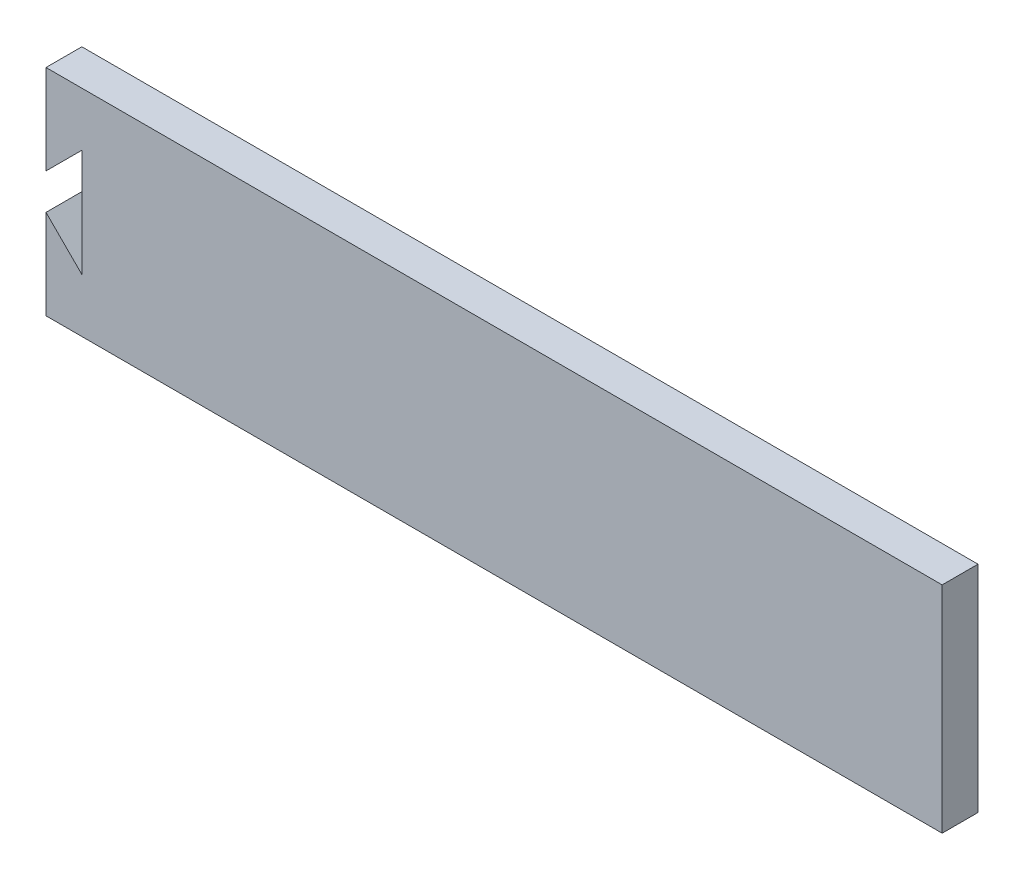
ISO-10303-21;
HEADER;
FILE_DESCRIPTION(('STEP AP214'),'2;1');
FILE_NAME('part.step','',(''),(''),'','','');
FILE_SCHEMA(('AUTOMOTIVE_DESIGN { 1 0 10303 214 1 1 1 1 }'));
ENDSEC;
DATA;
#1=APPLICATION_CONTEXT('core data for automotive mechanical design processes');
#2=APPLICATION_PROTOCOL_DEFINITION('international standard','automotive_design',2000,#1);
#3=PRODUCT_CONTEXT('',#1,'mechanical');
#4=PRODUCT('Part','Part','',(#3));
#5=PRODUCT_RELATED_PRODUCT_CATEGORY('part','',(#4));
#6=PRODUCT_DEFINITION_FORMATION('','',#4);
#7=PRODUCT_DEFINITION_CONTEXT('part definition',#1,'design');
#8=PRODUCT_DEFINITION('design','',#6,#7);
#9=PRODUCT_DEFINITION_SHAPE('','',#8);
#10=(LENGTH_UNIT() NAMED_UNIT(*) SI_UNIT(.MILLI.,.METRE.));
#11=(NAMED_UNIT(*) PLANE_ANGLE_UNIT() SI_UNIT($,.RADIAN.));
#12=(NAMED_UNIT(*) SI_UNIT($,.STERADIAN.) SOLID_ANGLE_UNIT());
#13=UNCERTAINTY_MEASURE_WITH_UNIT(LENGTH_MEASURE(1.E-05),#10,'distance_accuracy_value','');
#14=(GEOMETRIC_REPRESENTATION_CONTEXT(3) GLOBAL_UNCERTAINTY_ASSIGNED_CONTEXT((#13)) GLOBAL_UNIT_ASSIGNED_CONTEXT((#10,
#11,#12)) REPRESENTATION_CONTEXT('',''));
#15=CARTESIAN_POINT('',(0.,0.,0.));
#16=DIRECTION('',(0.,0.,1.));
#17=DIRECTION('',(1.,0.,0.));
#18=AXIS2_PLACEMENT_3D('',#15,#16,#17);
#19=CARTESIAN_POINT('',(-142.927308447937,66.0609037328095,10.));
#20=DIRECTION('',(1.,0.,0.));
#21=DIRECTION('',(0.,0.,-1.));
#22=AXIS2_PLACEMENT_3D('',#19,#20,#21);
#23=PLANE('',#22);
#24=DIRECTION('',(0.,-1.,0.));
#25=VECTOR('',#24,1.);
#26=CARTESIAN_POINT('',(-142.927308447937,66.0609037328095,0.));
#27=LINE('',#26,#25);
#28=CARTESIAN_POINT('',(-142.927308447937,66.0609037328095,0.));
#29=VERTEX_POINT('',#28);
#30=CARTESIAN_POINT('',(-142.927308447937,41.0609037328095,0.));
#31=VERTEX_POINT('',#30);
#32=EDGE_CURVE('E134',#29,#31,#27,.T.);
#33=ORIENTED_EDGE('',*,*,#32,.T.);
#34=DIRECTION('',(0.,0.,-1.));
#35=VECTOR('',#34,1.);
#36=CARTESIAN_POINT('',(-142.927308447937,41.0609037328095,0.));
#37=LINE('',#36,#35);
#38=CARTESIAN_POINT('',(-142.927308447937,41.0609037328095,10.));
#39=VERTEX_POINT('',#38);
#40=EDGE_CURVE('E129',#39,#31,#37,.T.);
#41=ORIENTED_EDGE('',*,*,#40,.F.);
#42=DIRECTION('',(0.,-1.,0.));
#43=VECTOR('',#42,1.);
#44=CARTESIAN_POINT('',(-142.927308447937,66.0609037328095,10.));
#45=LINE('',#44,#43);
#46=CARTESIAN_POINT('',(-142.927308447937,66.0609037328095,10.));
#47=VERTEX_POINT('',#46);
#48=EDGE_CURVE('E161',#47,#39,#45,.T.);
#49=ORIENTED_EDGE('',*,*,#48,.F.);
#50=DIRECTION('',(0.,0.,-1.));
#51=VECTOR('',#50,1.);
#52=CARTESIAN_POINT('',(-142.927308447937,66.0609037328095,10.));
#53=LINE('',#52,#51);
#54=EDGE_CURVE('E146',#47,#29,#53,.T.);
#55=ORIENTED_EDGE('',*,*,#54,.T.);
#56=EDGE_LOOP('',(#33,#41,#49,#55));
#57=FACE_BOUND('',#56,.T.);
#58=ADVANCED_FACE('F38',(#57),#23,.F.);
#59=CARTESIAN_POINT('',(-142.927308447937,31.0609037328095,10.));
#60=VERTEX_POINT('',#59);
#61=CARTESIAN_POINT('',(-142.927308447937,6.06090373280946,10.));
#62=VERTEX_POINT('',#61);
#63=EDGE_CURVE('E86',#60,#62,#45,.T.);
#64=ORIENTED_EDGE('',*,*,#63,.F.);
#65=DIRECTION('',(0.,0.,1.));
#66=VECTOR('',#65,1.);
#67=CARTESIAN_POINT('',(-142.927308447937,31.0609037328095,0.));
#68=LINE('',#67,#66);
#69=CARTESIAN_POINT('',(-142.927308447937,31.0609037328095,0.));
#70=VERTEX_POINT('',#69);
#71=EDGE_CURVE('E118',#70,#60,#68,.T.);
#72=ORIENTED_EDGE('',*,*,#71,.F.);
#73=CARTESIAN_POINT('',(-142.927308447937,6.06090373280946,0.));
#74=VERTEX_POINT('',#73);
#75=EDGE_CURVE('E127',#70,#74,#27,.T.);
#76=ORIENTED_EDGE('',*,*,#75,.T.);
#77=DIRECTION('',(0.,0.,-1.));
#78=VECTOR('',#77,1.);
#79=CARTESIAN_POINT('',(-142.927308447937,6.06090373280946,10.));
#80=LINE('',#79,#78);
#81=EDGE_CURVE('E11',#62,#74,#80,.T.);
#82=ORIENTED_EDGE('',*,*,#81,.F.);
#83=EDGE_LOOP('',(#64,#72,#76,#82));
#84=FACE_BOUND('',#83,.T.);
#85=ADVANCED_FACE('F40',(#84),#23,.F.);
#86=CARTESIAN_POINT('',(-142.927308447937,6.06090373280946,10.));
#87=DIRECTION('',(0.,1.,0.));
#88=DIRECTION('',(0.,0.,1.));
#89=AXIS2_PLACEMENT_3D('',#86,#87,#88);
#90=PLANE('',#89);
#91=DIRECTION('',(1.,0.,0.));
#92=VECTOR('',#91,1.);
#93=CARTESIAN_POINT('',(-142.927308447937,6.06090373280946,0.));
#94=LINE('',#93,#92);
#95=CARTESIAN_POINT('',(107.072691552063,6.06090373280946,0.));
#96=VERTEX_POINT('',#95);
#97=EDGE_CURVE('E133',#74,#96,#94,.T.);
#98=ORIENTED_EDGE('',*,*,#97,.T.);
#99=DIRECTION('',(0.,0.,-1.));
#100=VECTOR('',#99,1.);
#101=CARTESIAN_POINT('',(107.072691552063,6.06090373280946,10.));
#102=LINE('',#101,#100);
#103=CARTESIAN_POINT('',(107.072691552063,6.06090373280946,10.));
#104=VERTEX_POINT('',#103);
#105=EDGE_CURVE('E47',#104,#96,#102,.T.);
#106=ORIENTED_EDGE('',*,*,#105,.F.);
#107=DIRECTION('',(1.,0.,0.));
#108=VECTOR('',#107,1.);
#109=CARTESIAN_POINT('',(-142.927308447937,6.06090373280946,10.));
#110=LINE('',#109,#108);
#111=EDGE_CURVE('E163',#62,#104,#110,.T.);
#112=ORIENTED_EDGE('',*,*,#111,.F.);
#113=ORIENTED_EDGE('',*,*,#81,.T.);
#114=EDGE_LOOP('',(#98,#106,#112,#113));
#115=FACE_BOUND('',#114,.T.);
#116=ADVANCED_FACE('F195',(#115),#90,.F.);
#117=CARTESIAN_POINT('',(107.072691552063,66.0609037328095,10.));
#118=DIRECTION('',(-1.,0.,0.));
#119=DIRECTION('',(0.,-1.,0.));
#120=AXIS2_PLACEMENT_3D('',#117,#118,#119);
#121=PLANE('',#120);
#122=DIRECTION('',(0.,1.,0.));
#123=VECTOR('',#122,1.);
#124=CARTESIAN_POINT('',(107.072691552063,66.0609037328095,0.));
#125=LINE('',#124,#123);
#126=CARTESIAN_POINT('',(107.072691552063,66.0609037328095,0.));
#127=VERTEX_POINT('',#126);
#128=EDGE_CURVE('E73',#96,#127,#125,.T.);
#129=ORIENTED_EDGE('',*,*,#128,.T.);
#130=DIRECTION('',(0.,0.,-1.));
#131=VECTOR('',#130,1.);
#132=CARTESIAN_POINT('',(107.072691552063,66.0609037328095,10.));
#133=LINE('',#132,#131);
#134=CARTESIAN_POINT('',(107.072691552063,66.0609037328095,10.));
#135=VERTEX_POINT('',#134);
#136=EDGE_CURVE('E148',#135,#127,#133,.T.);
#137=ORIENTED_EDGE('',*,*,#136,.F.);
#138=DIRECTION('',(0.,1.,0.));
#139=VECTOR('',#138,1.);
#140=CARTESIAN_POINT('',(107.072691552063,66.0609037328095,10.));
#141=LINE('',#140,#139);
#142=EDGE_CURVE('E152',#104,#135,#141,.T.);
#143=ORIENTED_EDGE('',*,*,#142,.F.);
#144=ORIENTED_EDGE('',*,*,#105,.T.);
#145=EDGE_LOOP('',(#129,#137,#143,#144));
#146=FACE_BOUND('',#145,.T.);
#147=ADVANCED_FACE('F151',(#146),#121,.F.);
#148=CARTESIAN_POINT('',(-142.927308447937,66.0609037328095,10.));
#149=DIRECTION('',(0.,-1.,0.));
#150=DIRECTION('',(0.,0.,-1.));
#151=AXIS2_PLACEMENT_3D('',#148,#149,#150);
#152=PLANE('',#151);
#153=DIRECTION('',(-1.,0.,0.));
#154=VECTOR('',#153,1.);
#155=CARTESIAN_POINT('',(-142.927308447937,66.0609037328095,0.));
#156=LINE('',#155,#154);
#157=EDGE_CURVE('E79',#127,#29,#156,.T.);
#158=ORIENTED_EDGE('',*,*,#157,.T.);
#159=ORIENTED_EDGE('',*,*,#54,.F.);
#160=DIRECTION('',(-1.,0.,0.));
#161=VECTOR('',#160,1.);
#162=CARTESIAN_POINT('',(-142.927308447937,66.0609037328095,10.));
#163=LINE('',#162,#161);
#164=EDGE_CURVE('E55',#135,#47,#163,.T.);
#165=ORIENTED_EDGE('',*,*,#164,.F.);
#166=ORIENTED_EDGE('',*,*,#136,.T.);
#167=EDGE_LOOP('',(#158,#159,#165,#166));
#168=FACE_BOUND('',#167,.T.);
#169=ADVANCED_FACE('F162',(#168),#152,.F.);
#170=CARTESIAN_POINT('',(0.,0.,10.));
#171=DIRECTION('',(0.,0.,1.));
#172=DIRECTION('',(1.,0.,0.));
#173=AXIS2_PLACEMENT_3D('',#170,#171,#172);
#174=PLANE('',#173);
#175=DIRECTION('',(0.,1.,0.));
#176=VECTOR('',#175,1.);
#177=CARTESIAN_POINT('',(-132.927308447937,41.0609037328095,10.));
#178=LINE('',#177,#176);
#179=CARTESIAN_POINT('',(-132.927308447937,21.0609037328096,10.));
#180=VERTEX_POINT('',#179);
#181=CARTESIAN_POINT('',(-132.927308447937,51.0609037328094,10.));
#182=VERTEX_POINT('',#181);
#183=EDGE_CURVE('E135',#180,#182,#178,.T.);
#184=ORIENTED_EDGE('',*,*,#183,.F.);
#185=DIRECTION('',(0.707106781186551,-0.707106781186544,0.));
#186=VECTOR('',#185,1.);
#187=CARTESIAN_POINT('',(-142.927308447937,31.0609037328095,10.));
#188=LINE('',#187,#186);
#189=EDGE_CURVE('E123',#60,#180,#188,.T.);
#190=ORIENTED_EDGE('',*,*,#189,.F.);
#191=ORIENTED_EDGE('',*,*,#63,.T.);
#192=ORIENTED_EDGE('',*,*,#111,.T.);
#193=ORIENTED_EDGE('',*,*,#142,.T.);
#194=ORIENTED_EDGE('',*,*,#164,.T.);
#195=ORIENTED_EDGE('',*,*,#48,.T.);
#196=DIRECTION('',(-0.707106781186551,-0.707106781186544,0.));
#197=VECTOR('',#196,1.);
#198=CARTESIAN_POINT('',(-142.927308447937,41.0609037328095,10.));
#199=LINE('',#198,#197);
#200=EDGE_CURVE('E171',#182,#39,#199,.T.);
#201=ORIENTED_EDGE('',*,*,#200,.F.);
#202=EDGE_LOOP('',(#184,#190,#191,#192,#193,#194,#195,#201));
#203=FACE_BOUND('',#202,.T.);
#204=ADVANCED_FACE('F175',(#203),#174,.T.);
#205=CARTESIAN_POINT('',(0.,0.,0.));
#206=DIRECTION('',(0.,0.,1.));
#207=DIRECTION('',(1.,0.,0.));
#208=AXIS2_PLACEMENT_3D('',#205,#206,#207);
#209=PLANE('',#208);
#210=DIRECTION('',(0.707106781186551,-0.707106781186544,0.));
#211=VECTOR('',#210,1.);
#212=CARTESIAN_POINT('',(-142.927308447937,31.0609037328095,0.));
#213=LINE('',#212,#211);
#214=CARTESIAN_POINT('',(-132.927308447937,21.0609037328096,0.));
#215=VERTEX_POINT('',#214);
#216=EDGE_CURVE('E114',#70,#215,#213,.T.);
#217=ORIENTED_EDGE('',*,*,#216,.T.);
#218=DIRECTION('',(0.,-1.,0.));
#219=VECTOR('',#218,1.);
#220=CARTESIAN_POINT('',(-132.927308447937,41.0609037328095,0.));
#221=LINE('',#220,#219);
#222=CARTESIAN_POINT('',(-132.927308447937,51.0609037328094,0.));
#223=VERTEX_POINT('',#222);
#224=EDGE_CURVE('E138',#223,#215,#221,.T.);
#225=ORIENTED_EDGE('',*,*,#224,.F.);
#226=DIRECTION('',(-0.707106781186551,-0.707106781186544,0.));
#227=VECTOR('',#226,1.);
#228=CARTESIAN_POINT('',(-142.927308447937,41.0609037328095,0.));
#229=LINE('',#228,#227);
#230=EDGE_CURVE('E157',#223,#31,#229,.T.);
#231=ORIENTED_EDGE('',*,*,#230,.T.);
#232=ORIENTED_EDGE('',*,*,#32,.F.);
#233=ORIENTED_EDGE('',*,*,#157,.F.);
#234=ORIENTED_EDGE('',*,*,#128,.F.);
#235=ORIENTED_EDGE('',*,*,#97,.F.);
#236=ORIENTED_EDGE('',*,*,#75,.F.);
#237=EDGE_LOOP('',(#217,#225,#231,#232,#233,#234,#235,#236));
#238=FACE_BOUND('',#237,.T.);
#239=ADVANCED_FACE('F132',(#238),#209,.F.);
#240=CARTESIAN_POINT('',(-132.927308447937,0.,0.));
#241=DIRECTION('',(-1.,0.,0.));
#242=DIRECTION('',(0.,0.,1.));
#243=AXIS2_PLACEMENT_3D('',#240,#241,#242);
#244=PLANE('',#243);
#245=ORIENTED_EDGE('',*,*,#224,.T.);
#246=DIRECTION('',(0.,0.,1.));
#247=VECTOR('',#246,1.);
#248=CARTESIAN_POINT('',(-132.927308447937,21.0609037328096,0.));
#249=LINE('',#248,#247);
#250=EDGE_CURVE('E120',#215,#180,#249,.T.);
#251=ORIENTED_EDGE('',*,*,#250,.T.);
#252=ORIENTED_EDGE('',*,*,#183,.T.);
#253=DIRECTION('',(0.,0.,1.));
#254=VECTOR('',#253,1.);
#255=CARTESIAN_POINT('',(-132.927308447937,51.0609037328094,0.));
#256=LINE('',#255,#254);
#257=EDGE_CURVE('E130',#223,#182,#256,.T.);
#258=ORIENTED_EDGE('',*,*,#257,.F.);
#259=EDGE_LOOP('',(#245,#251,#252,#258));
#260=FACE_BOUND('',#259,.T.);
#261=ADVANCED_FACE('F179',(#260),#244,.T.);
#262=CARTESIAN_POINT('',(-142.927308447937,41.0609037328095,0.));
#263=DIRECTION('',(-0.707106781186544,0.707106781186551,0.));
#264=DIRECTION('',(-0.707106781186551,-0.707106781186544,0.));
#265=AXIS2_PLACEMENT_3D('',#262,#263,#264);
#266=PLANE('',#265);
#267=ORIENTED_EDGE('',*,*,#200,.T.);
#268=ORIENTED_EDGE('',*,*,#40,.T.);
#269=ORIENTED_EDGE('',*,*,#230,.F.);
#270=ORIENTED_EDGE('',*,*,#257,.T.);
#271=EDGE_LOOP('',(#267,#268,#269,#270));
#272=FACE_BOUND('',#271,.T.);
#273=ADVANCED_FACE('F181',(#272),#266,.F.);
#274=CARTESIAN_POINT('',(-142.927308447937,31.0609037328095,0.));
#275=DIRECTION('',(-0.707106781186544,-0.707106781186551,0.));
#276=DIRECTION('',(0.707106781186551,-0.707106781186544,0.));
#277=AXIS2_PLACEMENT_3D('',#274,#275,#276);
#278=PLANE('',#277);
#279=ORIENTED_EDGE('',*,*,#189,.T.);
#280=ORIENTED_EDGE('',*,*,#250,.F.);
#281=ORIENTED_EDGE('',*,*,#216,.F.);
#282=ORIENTED_EDGE('',*,*,#71,.T.);
#283=EDGE_LOOP('',(#279,#280,#281,#282));
#284=FACE_BOUND('',#283,.T.);
#285=ADVANCED_FACE('F117',(#284),#278,.F.);
#286=CLOSED_SHELL('',(#58,#85,#116,#147,#169,#204,#239,#261,#273,#285));
#287=MANIFOLD_SOLID_BREP('B2',#286);
#288=ADVANCED_BREP_SHAPE_REPRESENTATION('',(#18,#287),#14);
#289=SHAPE_DEFINITION_REPRESENTATION(#9,#288);
ENDSEC;
END-ISO-10303-21;
